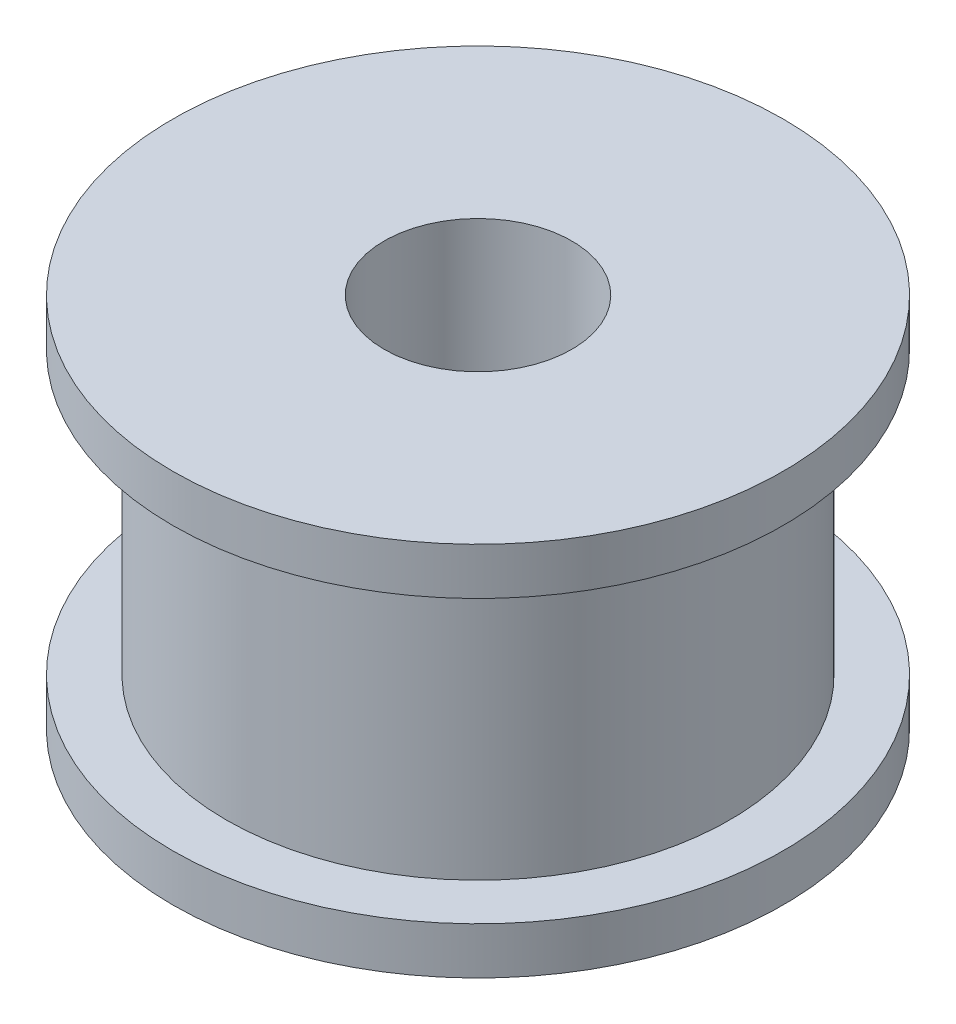
ISO-10303-21;
HEADER;
FILE_DESCRIPTION(('STEP AP214'),'2;1');
FILE_NAME('part.step','',(''),(''),'','','');
FILE_SCHEMA(('AUTOMOTIVE_DESIGN { 1 0 10303 214 1 1 1 1 }'));
ENDSEC;
DATA;
#1=APPLICATION_CONTEXT('core data for automotive mechanical design processes');
#2=APPLICATION_PROTOCOL_DEFINITION('international standard','automotive_design',2000,#1);
#3=PRODUCT_CONTEXT('',#1,'mechanical');
#4=PRODUCT('Part','Part','',(#3));
#5=PRODUCT_RELATED_PRODUCT_CATEGORY('part','',(#4));
#6=PRODUCT_DEFINITION_FORMATION('','',#4);
#7=PRODUCT_DEFINITION_CONTEXT('part definition',#1,'design');
#8=PRODUCT_DEFINITION('design','',#6,#7);
#9=PRODUCT_DEFINITION_SHAPE('','',#8);
#10=(LENGTH_UNIT() NAMED_UNIT(*) SI_UNIT(.MILLI.,.METRE.));
#11=(NAMED_UNIT(*) PLANE_ANGLE_UNIT() SI_UNIT($,.RADIAN.));
#12=(NAMED_UNIT(*) SI_UNIT($,.STERADIAN.) SOLID_ANGLE_UNIT());
#13=UNCERTAINTY_MEASURE_WITH_UNIT(LENGTH_MEASURE(1.E-05),#10,'distance_accuracy_value','');
#14=(GEOMETRIC_REPRESENTATION_CONTEXT(3) GLOBAL_UNCERTAINTY_ASSIGNED_CONTEXT((#13)) GLOBAL_UNIT_ASSIGNED_CONTEXT((#10,
#11,#12)) REPRESENTATION_CONTEXT('',''));
#15=CARTESIAN_POINT('',(0.,0.,0.));
#16=DIRECTION('',(0.,0.,1.));
#17=DIRECTION('',(1.,0.,0.));
#18=AXIS2_PLACEMENT_3D('',#15,#16,#17);
#19=CARTESIAN_POINT('',(0.,6.,0.));
#20=DIRECTION('',(0.,-1.,0.));
#21=DIRECTION('',(0.,0.,-1.));
#22=AXIS2_PLACEMENT_3D('',#19,#20,#21);
#23=CYLINDRICAL_SURFACE('',#22,10.725);
#24=CARTESIAN_POINT('',(0.,6.,0.));
#25=DIRECTION('',(0.,1.,0.));
#26=DIRECTION('',(0.,0.,1.));
#27=AXIS2_PLACEMENT_3D('',#24,#25,#26);
#28=CIRCLE('',#27,10.725);
#29=CARTESIAN_POINT('',(0.,6.,10.725));
#30=VERTEX_POINT('',#29);
#31=EDGE_CURVE('E10',#30,#30,#28,.T.);
#32=ORIENTED_EDGE('',*,*,#31,.F.);
#33=EDGE_LOOP('',(#32));
#34=FACE_BOUND('',#33,.T.);
#35=CARTESIAN_POINT('',(0.,-6.,0.));
#36=DIRECTION('',(0.,1.,0.));
#37=DIRECTION('',(0.,0.,1.));
#38=AXIS2_PLACEMENT_3D('',#35,#36,#37);
#39=CIRCLE('',#38,10.725);
#40=CARTESIAN_POINT('',(0.,-6.,10.725));
#41=VERTEX_POINT('',#40);
#42=EDGE_CURVE('E36',#41,#41,#39,.T.);
#43=ORIENTED_EDGE('',*,*,#42,.T.);
#44=EDGE_LOOP('',(#43));
#45=FACE_BOUND('',#44,.T.);
#46=ADVANCED_FACE('F33',(#34,#45),#23,.T.);
#47=CARTESIAN_POINT('',(0.,8.,0.));
#48=DIRECTION('',(0.,-1.,0.));
#49=DIRECTION('',(0.,0.,-1.));
#50=AXIS2_PLACEMENT_3D('',#47,#48,#49);
#51=CYLINDRICAL_SURFACE('',#50,13.);
#52=CARTESIAN_POINT('',(0.,8.,0.));
#53=DIRECTION('',(0.,1.,0.));
#54=DIRECTION('',(0.,0.,1.));
#55=AXIS2_PLACEMENT_3D('',#52,#53,#54);
#56=CIRCLE('',#55,13.);
#57=CARTESIAN_POINT('',(0.,8.,13.));
#58=VERTEX_POINT('',#57);
#59=EDGE_CURVE('E40',#58,#58,#56,.T.);
#60=ORIENTED_EDGE('',*,*,#59,.F.);
#61=EDGE_LOOP('',(#60));
#62=FACE_BOUND('',#61,.T.);
#63=CARTESIAN_POINT('',(0.,6.,0.));
#64=DIRECTION('',(0.,1.,0.));
#65=DIRECTION('',(0.,0.,1.));
#66=AXIS2_PLACEMENT_3D('',#63,#64,#65);
#67=CIRCLE('',#66,13.);
#68=CARTESIAN_POINT('',(0.,6.,13.));
#69=VERTEX_POINT('',#68);
#70=EDGE_CURVE('E44',#69,#69,#67,.T.);
#71=ORIENTED_EDGE('',*,*,#70,.T.);
#72=EDGE_LOOP('',(#71));
#73=FACE_BOUND('',#72,.T.);
#74=ADVANCED_FACE('F69',(#62,#73),#51,.T.);
#75=CARTESIAN_POINT('',(0.,8.,0.));
#76=DIRECTION('',(0.,1.,0.));
#77=DIRECTION('',(0.,0.,1.));
#78=AXIS2_PLACEMENT_3D('',#75,#76,#77);
#79=PLANE('',#78);
#80=CARTESIAN_POINT('',(0.,8.,0.));
#81=DIRECTION('',(0.,1.,0.));
#82=DIRECTION('',(0.,0.,1.));
#83=AXIS2_PLACEMENT_3D('',#80,#81,#82);
#84=CIRCLE('',#83,4.);
#85=CARTESIAN_POINT('',(0.,8.,4.));
#86=VERTEX_POINT('',#85);
#87=EDGE_CURVE('E58',#86,#86,#84,.T.);
#88=ORIENTED_EDGE('',*,*,#87,.F.);
#89=EDGE_LOOP('',(#88));
#90=FACE_BOUND('',#89,.T.);
#91=ORIENTED_EDGE('',*,*,#59,.T.);
#92=EDGE_LOOP('',(#91));
#93=FACE_BOUND('',#92,.T.);
#94=ADVANCED_FACE('F65',(#90,#93),#79,.T.);
#95=CARTESIAN_POINT('',(0.,6.,0.));
#96=DIRECTION('',(0.,1.,0.));
#97=DIRECTION('',(0.,0.,1.));
#98=AXIS2_PLACEMENT_3D('',#95,#96,#97);
#99=PLANE('',#98);
#100=ORIENTED_EDGE('',*,*,#31,.T.);
#101=EDGE_LOOP('',(#100));
#102=FACE_BOUND('',#101,.T.);
#103=ORIENTED_EDGE('',*,*,#70,.F.);
#104=EDGE_LOOP('',(#103));
#105=FACE_BOUND('',#104,.T.);
#106=ADVANCED_FACE('F68',(#102,#105),#99,.F.);
#107=CARTESIAN_POINT('',(0.,-8.,0.));
#108=DIRECTION('',(0.,1.,0.));
#109=DIRECTION('',(0.,0.,1.));
#110=AXIS2_PLACEMENT_3D('',#107,#108,#109);
#111=CYLINDRICAL_SURFACE('',#110,13.);
#112=CARTESIAN_POINT('',(0.,-8.,0.));
#113=DIRECTION('',(0.,1.,0.));
#114=DIRECTION('',(0.,0.,1.));
#115=AXIS2_PLACEMENT_3D('',#112,#113,#114);
#116=CIRCLE('',#115,13.);
#117=CARTESIAN_POINT('',(0.,-8.,13.));
#118=VERTEX_POINT('',#117);
#119=EDGE_CURVE('E52',#118,#118,#116,.T.);
#120=ORIENTED_EDGE('',*,*,#119,.T.);
#121=EDGE_LOOP('',(#120));
#122=FACE_BOUND('',#121,.T.);
#123=CARTESIAN_POINT('',(0.,-6.,0.));
#124=DIRECTION('',(0.,1.,0.));
#125=DIRECTION('',(0.,0.,1.));
#126=AXIS2_PLACEMENT_3D('',#123,#124,#125);
#127=CIRCLE('',#126,13.);
#128=CARTESIAN_POINT('',(0.,-6.,13.));
#129=VERTEX_POINT('',#128);
#130=EDGE_CURVE('E49',#129,#129,#127,.T.);
#131=ORIENTED_EDGE('',*,*,#130,.F.);
#132=EDGE_LOOP('',(#131));
#133=FACE_BOUND('',#132,.T.);
#134=ADVANCED_FACE('F78',(#122,#133),#111,.T.);
#135=CARTESIAN_POINT('',(0.,-8.,0.));
#136=DIRECTION('',(0.,1.,0.));
#137=DIRECTION('',(0.,0.,1.));
#138=AXIS2_PLACEMENT_3D('',#135,#136,#137);
#139=PLANE('',#138);
#140=CARTESIAN_POINT('',(0.,-8.,0.));
#141=DIRECTION('',(0.,1.,0.));
#142=DIRECTION('',(0.,0.,1.));
#143=AXIS2_PLACEMENT_3D('',#140,#141,#142);
#144=CIRCLE('',#143,4.);
#145=CARTESIAN_POINT('',(0.,-8.,4.));
#146=VERTEX_POINT('',#145);
#147=EDGE_CURVE('E53',#146,#146,#144,.F.);
#148=ORIENTED_EDGE('',*,*,#147,.F.);
#149=EDGE_LOOP('',(#148));
#150=FACE_BOUND('',#149,.T.);
#151=ORIENTED_EDGE('',*,*,#119,.F.);
#152=EDGE_LOOP('',(#151));
#153=FACE_BOUND('',#152,.T.);
#154=ADVANCED_FACE('F83',(#150,#153),#139,.F.);
#155=CARTESIAN_POINT('',(0.,-6.,0.));
#156=DIRECTION('',(0.,1.,0.));
#157=DIRECTION('',(0.,0.,1.));
#158=AXIS2_PLACEMENT_3D('',#155,#156,#157);
#159=PLANE('',#158);
#160=ORIENTED_EDGE('',*,*,#42,.F.);
#161=EDGE_LOOP('',(#160));
#162=FACE_BOUND('',#161,.T.);
#163=ORIENTED_EDGE('',*,*,#130,.T.);
#164=EDGE_LOOP('',(#163));
#165=FACE_BOUND('',#164,.T.);
#166=ADVANCED_FACE('F94',(#162,#165),#159,.T.);
#167=CARTESIAN_POINT('',(0.,-8.001,0.));
#168=DIRECTION('',(0.,1.,0.));
#169=DIRECTION('',(0.,0.,1.));
#170=AXIS2_PLACEMENT_3D('',#167,#168,#169);
#171=CYLINDRICAL_SURFACE('',#170,4.);
#172=ORIENTED_EDGE('',*,*,#87,.T.);
#173=EDGE_LOOP('',(#172));
#174=FACE_BOUND('',#173,.T.);
#175=ORIENTED_EDGE('',*,*,#147,.T.);
#176=EDGE_LOOP('',(#175));
#177=FACE_BOUND('',#176,.T.);
#178=ADVANCED_FACE('F62',(#174,#177),#171,.F.);
#179=CLOSED_SHELL('',(#46,#74,#94,#106,#134,#154,#166,#178));
#180=MANIFOLD_SOLID_BREP('B2',#179);
#181=ADVANCED_BREP_SHAPE_REPRESENTATION('',(#18,#180),#14);
#182=SHAPE_DEFINITION_REPRESENTATION(#9,#181);
ENDSEC;
END-ISO-10303-21;
